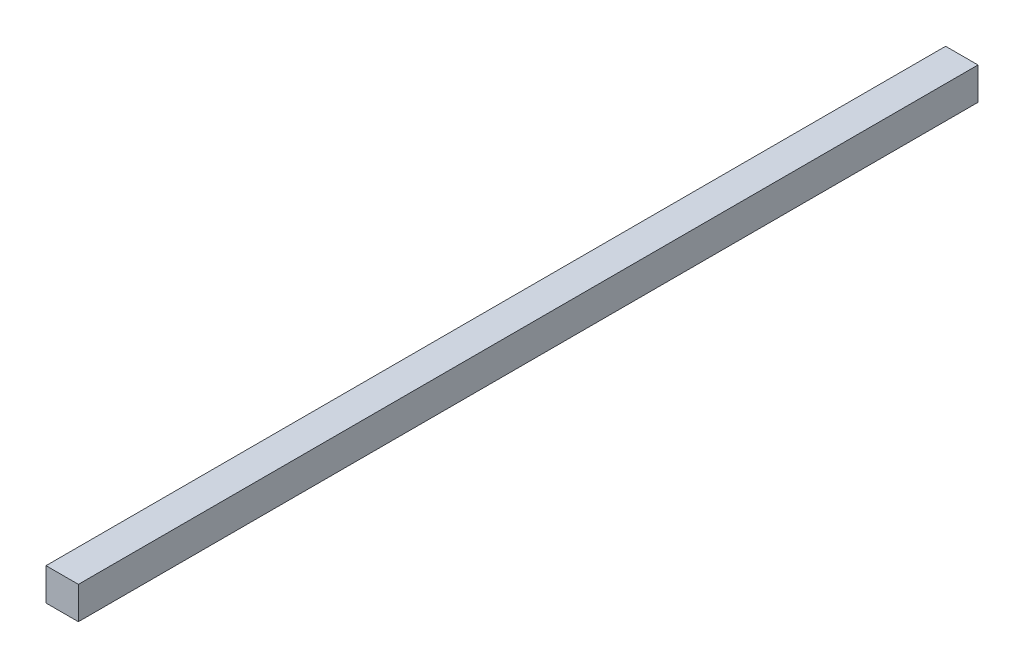
ISO-10303-21;
HEADER;
FILE_DESCRIPTION(('STEP AP214'),'2;1');
FILE_NAME('part.step','',(''),(''),'','','');
FILE_SCHEMA(('AUTOMOTIVE_DESIGN { 1 0 10303 214 1 1 1 1 }'));
ENDSEC;
DATA;
#1=APPLICATION_CONTEXT('core data for automotive mechanical design processes');
#2=APPLICATION_PROTOCOL_DEFINITION('international standard','automotive_design',2000,#1);
#3=PRODUCT_CONTEXT('',#1,'mechanical');
#4=PRODUCT('Part','Part','',(#3));
#5=PRODUCT_RELATED_PRODUCT_CATEGORY('part','',(#4));
#6=PRODUCT_DEFINITION_FORMATION('','',#4);
#7=PRODUCT_DEFINITION_CONTEXT('part definition',#1,'design');
#8=PRODUCT_DEFINITION('design','',#6,#7);
#9=PRODUCT_DEFINITION_SHAPE('','',#8);
#10=(LENGTH_UNIT() NAMED_UNIT(*) SI_UNIT(.MILLI.,.METRE.));
#11=(NAMED_UNIT(*) PLANE_ANGLE_UNIT() SI_UNIT($,.RADIAN.));
#12=(NAMED_UNIT(*) SI_UNIT($,.STERADIAN.) SOLID_ANGLE_UNIT());
#13=UNCERTAINTY_MEASURE_WITH_UNIT(LENGTH_MEASURE(1.E-05),#10,'distance_accuracy_value','');
#14=(GEOMETRIC_REPRESENTATION_CONTEXT(3) GLOBAL_UNCERTAINTY_ASSIGNED_CONTEXT((#13)) GLOBAL_UNIT_ASSIGNED_CONTEXT((#10,
#11,#12)) REPRESENTATION_CONTEXT('',''));
#15=CARTESIAN_POINT('',(0.,0.,0.));
#16=DIRECTION('',(0.,0.,1.));
#17=DIRECTION('',(1.,0.,0.));
#18=AXIS2_PLACEMENT_3D('',#15,#16,#17);
#19=CARTESIAN_POINT('',(-89.,-8.99999999999999,500.));
#20=DIRECTION('',(1.,0.,0.));
#21=DIRECTION('',(0.,0.,-1.));
#22=AXIS2_PLACEMENT_3D('',#19,#20,#21);
#23=PLANE('',#22);
#24=DIRECTION('',(0.,-1.,0.));
#25=VECTOR('',#24,1.);
#26=CARTESIAN_POINT('',(-89.,-8.99999999999999,0.));
#27=LINE('',#26,#25);
#28=CARTESIAN_POINT('',(-89.,9.00000000000001,0.));
#29=VERTEX_POINT('',#28);
#30=CARTESIAN_POINT('',(-89.,-8.99999999999999,0.));
#31=VERTEX_POINT('',#30);
#32=EDGE_CURVE('E101',#29,#31,#27,.T.);
#33=ORIENTED_EDGE('',*,*,#32,.T.);
#34=DIRECTION('',(0.,0.,-1.));
#35=VECTOR('',#34,1.);
#36=CARTESIAN_POINT('',(-89.,-8.99999999999999,500.));
#37=LINE('',#36,#35);
#38=CARTESIAN_POINT('',(-89.,-8.99999999999999,500.));
#39=VERTEX_POINT('',#38);
#40=EDGE_CURVE('E11',#39,#31,#37,.T.);
#41=ORIENTED_EDGE('',*,*,#40,.F.);
#42=DIRECTION('',(0.,-1.,0.));
#43=VECTOR('',#42,1.);
#44=CARTESIAN_POINT('',(-89.,-8.99999999999999,500.));
#45=LINE('',#44,#43);
#46=CARTESIAN_POINT('',(-89.,9.00000000000001,500.));
#47=VERTEX_POINT('',#46);
#48=EDGE_CURVE('E89',#47,#39,#45,.T.);
#49=ORIENTED_EDGE('',*,*,#48,.F.);
#50=DIRECTION('',(0.,0.,-1.));
#51=VECTOR('',#50,1.);
#52=CARTESIAN_POINT('',(-89.,9.00000000000001,500.));
#53=LINE('',#52,#51);
#54=EDGE_CURVE('E97',#47,#29,#53,.T.);
#55=ORIENTED_EDGE('',*,*,#54,.T.);
#56=EDGE_LOOP('',(#33,#41,#49,#55));
#57=FACE_BOUND('',#56,.T.);
#58=ADVANCED_FACE('F38',(#57),#23,.F.);
#59=CARTESIAN_POINT('',(-71.,-8.99999999999999,500.));
#60=DIRECTION('',(0.,1.,0.));
#61=DIRECTION('',(-1.,0.,0.));
#62=AXIS2_PLACEMENT_3D('',#59,#60,#61);
#63=PLANE('',#62);
#64=DIRECTION('',(1.,0.,0.));
#65=VECTOR('',#64,1.);
#66=CARTESIAN_POINT('',(-71.,-8.99999999999999,0.));
#67=LINE('',#66,#65);
#68=CARTESIAN_POINT('',(-71.,-8.99999999999999,0.));
#69=VERTEX_POINT('',#68);
#70=EDGE_CURVE('E93',#31,#69,#67,.T.);
#71=ORIENTED_EDGE('',*,*,#70,.T.);
#72=DIRECTION('',(0.,0.,-1.));
#73=VECTOR('',#72,1.);
#74=CARTESIAN_POINT('',(-71.,-8.99999999999999,500.));
#75=LINE('',#74,#73);
#76=CARTESIAN_POINT('',(-71.,-8.99999999999999,500.));
#77=VERTEX_POINT('',#76);
#78=EDGE_CURVE('E46',#77,#69,#75,.T.);
#79=ORIENTED_EDGE('',*,*,#78,.F.);
#80=DIRECTION('',(1.,0.,0.));
#81=VECTOR('',#80,1.);
#82=CARTESIAN_POINT('',(-71.,-8.99999999999999,500.));
#83=LINE('',#82,#81);
#84=EDGE_CURVE('E84',#39,#77,#83,.T.);
#85=ORIENTED_EDGE('',*,*,#84,.F.);
#86=ORIENTED_EDGE('',*,*,#40,.T.);
#87=EDGE_LOOP('',(#71,#79,#85,#86));
#88=FACE_BOUND('',#87,.T.);
#89=ADVANCED_FACE('F92',(#88),#63,.F.);
#90=CARTESIAN_POINT('',(-71.,-8.99999999999999,500.));
#91=DIRECTION('',(-1.,0.,0.));
#92=DIRECTION('',(0.,0.,1.));
#93=AXIS2_PLACEMENT_3D('',#90,#91,#92);
#94=PLANE('',#93);
#95=DIRECTION('',(0.,1.,0.));
#96=VECTOR('',#95,1.);
#97=CARTESIAN_POINT('',(-71.,-8.99999999999999,0.));
#98=LINE('',#97,#96);
#99=CARTESIAN_POINT('',(-71.,9.00000000000001,0.));
#100=VERTEX_POINT('',#99);
#101=EDGE_CURVE('E71',#69,#100,#98,.T.);
#102=ORIENTED_EDGE('',*,*,#101,.T.);
#103=DIRECTION('',(0.,0.,-1.));
#104=VECTOR('',#103,1.);
#105=CARTESIAN_POINT('',(-71.,9.00000000000001,500.));
#106=LINE('',#105,#104);
#107=CARTESIAN_POINT('',(-71.,9.00000000000001,500.));
#108=VERTEX_POINT('',#107);
#109=EDGE_CURVE('E94',#108,#100,#106,.T.);
#110=ORIENTED_EDGE('',*,*,#109,.F.);
#111=DIRECTION('',(0.,1.,0.));
#112=VECTOR('',#111,1.);
#113=CARTESIAN_POINT('',(-71.,-8.99999999999999,500.));
#114=LINE('',#113,#112);
#115=EDGE_CURVE('E87',#77,#108,#114,.T.);
#116=ORIENTED_EDGE('',*,*,#115,.F.);
#117=ORIENTED_EDGE('',*,*,#78,.T.);
#118=EDGE_LOOP('',(#102,#110,#116,#117));
#119=FACE_BOUND('',#118,.T.);
#120=ADVANCED_FACE('F95',(#119),#94,.F.);
#121=CARTESIAN_POINT('',(-71.,9.00000000000001,500.));
#122=DIRECTION('',(0.,-1.,0.));
#123=DIRECTION('',(1.,0.,0.));
#124=AXIS2_PLACEMENT_3D('',#121,#122,#123);
#125=PLANE('',#124);
#126=DIRECTION('',(-1.,0.,0.));
#127=VECTOR('',#126,1.);
#128=CARTESIAN_POINT('',(-71.,9.00000000000001,0.));
#129=LINE('',#128,#127);
#130=EDGE_CURVE('E77',#100,#29,#129,.T.);
#131=ORIENTED_EDGE('',*,*,#130,.T.);
#132=ORIENTED_EDGE('',*,*,#54,.F.);
#133=DIRECTION('',(-1.,0.,0.));
#134=VECTOR('',#133,1.);
#135=CARTESIAN_POINT('',(-71.,9.00000000000001,500.));
#136=LINE('',#135,#134);
#137=EDGE_CURVE('E54',#108,#47,#136,.T.);
#138=ORIENTED_EDGE('',*,*,#137,.F.);
#139=ORIENTED_EDGE('',*,*,#109,.T.);
#140=EDGE_LOOP('',(#131,#132,#138,#139));
#141=FACE_BOUND('',#140,.T.);
#142=ADVANCED_FACE('F108',(#141),#125,.F.);
#143=CARTESIAN_POINT('',(0.,0.,500.));
#144=DIRECTION('',(0.,0.,1.));
#145=DIRECTION('',(1.,0.,0.));
#146=AXIS2_PLACEMENT_3D('',#143,#144,#145);
#147=PLANE('',#146);
#148=ORIENTED_EDGE('',*,*,#48,.T.);
#149=ORIENTED_EDGE('',*,*,#84,.T.);
#150=ORIENTED_EDGE('',*,*,#115,.T.);
#151=ORIENTED_EDGE('',*,*,#137,.T.);
#152=EDGE_LOOP('',(#148,#149,#150,#151));
#153=FACE_BOUND('',#152,.T.);
#154=ADVANCED_FACE('F85',(#153),#147,.T.);
#155=CARTESIAN_POINT('',(0.,0.,0.));
#156=DIRECTION('',(0.,0.,1.));
#157=DIRECTION('',(1.,0.,0.));
#158=AXIS2_PLACEMENT_3D('',#155,#156,#157);
#159=PLANE('',#158);
#160=ORIENTED_EDGE('',*,*,#32,.F.);
#161=ORIENTED_EDGE('',*,*,#130,.F.);
#162=ORIENTED_EDGE('',*,*,#101,.F.);
#163=ORIENTED_EDGE('',*,*,#70,.F.);
#164=EDGE_LOOP('',(#160,#161,#162,#163));
#165=FACE_BOUND('',#164,.T.);
#166=ADVANCED_FACE('F111',(#165),#159,.F.);
#167=CLOSED_SHELL('',(#58,#89,#120,#142,#154,#166));
#168=MANIFOLD_SOLID_BREP('B2',#167);
#169=ADVANCED_BREP_SHAPE_REPRESENTATION('',(#18,#168),#14);
#170=SHAPE_DEFINITION_REPRESENTATION(#9,#169);
ENDSEC;
END-ISO-10303-21;
